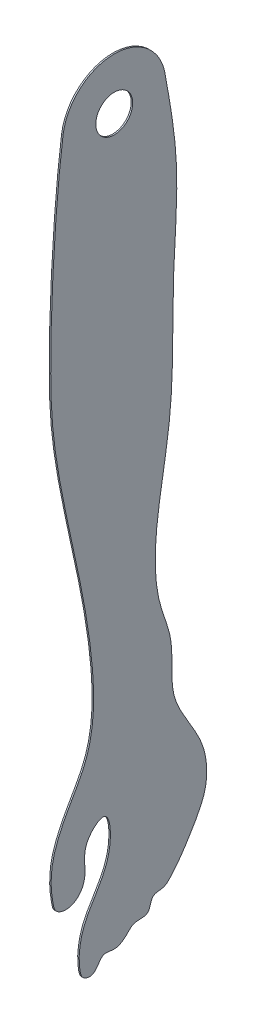
ISO-10303-21;
HEADER;
FILE_DESCRIPTION(('STEP AP214'),'2;1');
FILE_NAME('part.step','',(''),(''),'','','');
FILE_SCHEMA(('AUTOMOTIVE_DESIGN { 1 0 10303 214 1 1 1 1 }'));
ENDSEC;
DATA;
#1=APPLICATION_CONTEXT('core data for automotive mechanical design processes');
#2=APPLICATION_PROTOCOL_DEFINITION('international standard','automotive_design',2000,#1);
#3=PRODUCT_CONTEXT('',#1,'mechanical');
#4=PRODUCT('Part','Part','',(#3));
#5=PRODUCT_RELATED_PRODUCT_CATEGORY('part','',(#4));
#6=PRODUCT_DEFINITION_FORMATION('','',#4);
#7=PRODUCT_DEFINITION_CONTEXT('part definition',#1,'design');
#8=PRODUCT_DEFINITION('design','',#6,#7);
#9=PRODUCT_DEFINITION_SHAPE('','',#8);
#10=(LENGTH_UNIT() NAMED_UNIT(*) SI_UNIT(.MILLI.,.METRE.));
#11=(NAMED_UNIT(*) PLANE_ANGLE_UNIT() SI_UNIT($,.RADIAN.));
#12=(NAMED_UNIT(*) SI_UNIT($,.STERADIAN.) SOLID_ANGLE_UNIT());
#13=UNCERTAINTY_MEASURE_WITH_UNIT(LENGTH_MEASURE(1.E-05),#10,'distance_accuracy_value','');
#14=(GEOMETRIC_REPRESENTATION_CONTEXT(3) GLOBAL_UNCERTAINTY_ASSIGNED_CONTEXT((#13)) GLOBAL_UNIT_ASSIGNED_CONTEXT((#10,
#11,#12)) REPRESENTATION_CONTEXT('',''));
#15=CARTESIAN_POINT('',(0.,0.,0.));
#16=DIRECTION('',(0.,0.,1.));
#17=DIRECTION('',(1.,0.,0.));
#18=AXIS2_PLACEMENT_3D('',#15,#16,#17);
#19=CARTESIAN_POINT('',(0.5,-470.695495920654,-32.564069297625));
#20=DIRECTION('',(-1.,0.,0.));
#21=DIRECTION('',(0.,0.,1.));
#22=AXIS2_PLACEMENT_3D('',#19,#20,#21);
#23=PLANE('',#22);
#24=CARTESIAN_POINT('',(0.5,4.84342607559019,34.663254663264));
#25=CARTESIAN_POINT('',(0.5,-27.6945101411992,39.2097143148243));
#26=CARTESIAN_POINT('',(0.5,-94.602341537494,43.8253437916141));
#27=CARTESIAN_POINT('',(0.5,-198.598302487994,41.9481905668525));
#28=CARTESIAN_POINT('',(0.5,-277.322783368698,14.2559636365352));
#29=CARTESIAN_POINT('',(0.5,-368.678198151885,12.6392348257419));
#30=CARTESIAN_POINT('',(0.5,-395.489292518655,34.7778587810881));
#31=CARTESIAN_POINT('',(0.5,-424.363716062608,43.9961982217251));
#32=CARTESIAN_POINT('',(0.5,-438.492947409828,42.4433739515045));
#33=CARTESIAN_POINT('',(0.5,-449.39351604392,40.0542419448712));
#34=CARTESIAN_POINT('',(0.5,-452.844976712865,28.6471589689562));
#35=CARTESIAN_POINT('',(0.5,-438.487431053053,15.8626505210391));
#36=CARTESIAN_POINT('',(0.5,-420.969365898723,24.6171518315931));
#37=CARTESIAN_POINT('',(0.5,-402.825630116979,4.10890140988524));
#38=CARTESIAN_POINT('',(0.5,-441.301358898829,-0.432349691545669));
#39=CARTESIAN_POINT('',(0.5,-457.553565045305,22.1795761977817));
#40=CARTESIAN_POINT('',(0.5,-486.558139521146,24.6349685175613));
#41=CARTESIAN_POINT('',(0.5,-497.149262830604,21.7490331244814));
#42=CARTESIAN_POINT('',(0.5,-500.057224659205,12.2916528858937));
#43=CARTESIAN_POINT('',(0.5,-487.522190972307,9.37691063868993));
#44=CARTESIAN_POINT('',(0.5,-491.594407946684,-1.21192247305871));
#45=CARTESIAN_POINT('',(0.5,-486.857235759237,-7.89661129154015));
#46=CARTESIAN_POINT('',(0.5,-480.101469825372,-13.4267508486342));
#47=CARTESIAN_POINT('',(0.5,-483.037631145475,-24.4663014557142));
#48=CARTESIAN_POINT('',(0.5,-470.049165916606,-24.5979004021521));
#49=CARTESIAN_POINT('',(0.5,-471.666382451168,-33.1257170838295));
#50=CARTESIAN_POINT('',(0.5,-462.941926344635,-42.7563367641466));
#51=CARTESIAN_POINT('',(0.5,-439.795919170851,-57.4218579267833));
#52=CARTESIAN_POINT('',(0.5,-421.922104703587,-63.5966285254258));
#53=CARTESIAN_POINT('',(0.5,-393.728942846172,-62.0936437236474));
#54=CARTESIAN_POINT('',(0.5,-366.180340210842,-34.9063663756032));
#55=CARTESIAN_POINT('',(0.5,-330.246003030058,-41.4700836991726));
#56=CARTESIAN_POINT('',(0.5,-279.816511076801,-19.3597958544962));
#57=CARTESIAN_POINT('',(0.5,-206.310424789051,-42.2092897836021));
#58=CARTESIAN_POINT('',(0.5,-121.859738431938,-38.1853590858408));
#59=CARTESIAN_POINT('',(0.5,-53.3820430506886,-44.9238099029606));
#60=CARTESIAN_POINT('',(0.5,-13.9916706165611,-38.0783024191802));
#61=CARTESIAN_POINT('',(0.5,4.01677711395926,-34.7687431699331));
#62=B_SPLINE_CURVE_WITH_KNOTS('',3,(#24,#25,#26,#27,#28,#29,#30,#31,#32,#33,#34,#35,#36,#37,#38,
#39,#40,#41,#42,#43,#44,#45,#46,#47,#48,#49,#50,#51,#52,#53,#54,#55,#56,#57,#58,#59,#60,#61),
.UNSPECIFIED.,.F.,.F.,(4,1,1,1,1,1,1,1,1,1,1,1,1,1,1,1,1,1,1,1,1,1,1,1,1,1,1,1,1,1,1,1,1,1,1,4),
(0.,0.0812816878309083,0.100900369627512,0.19618681796604,0.230170317341964,0.256809284422416,
0.261911269248106,0.27904806600434,0.28214693998285,0.290757909438674,0.303690757779682,
0.325214072900232,0.338388057280681,0.352847421297276,0.39712228397798,0.418552512933069,
0.421852214822318,0.430119302870476,0.442912300460825,0.451129664267341,0.462260478364209,
0.468901072458414,0.480315632075845,0.490025771006037,0.499359222531804,0.503696536529243,
0.530098647152515,0.536467206925385,0.564081870430035,0.611865287841324,0.646902569601267,
0.670168967748456,0.781143971862764,0.870016231410823,0.93787950709035,0.9950979500628),.UNSPECIFIED.);
#63=CARTESIAN_POINT('',(0.5,4.84342607559018,34.663254663264));
#64=VERTEX_POINT('',#63);
#65=CARTESIAN_POINT('',(0.5,4.01677711395927,-34.7687431699332));
#66=VERTEX_POINT('',#65);
#67=EDGE_CURVE('E67',#64,#66,#62,.T.);
#68=ORIENTED_EDGE('',*,*,#67,.T.);
#69=CARTESIAN_POINT('',(0.5,0.,0.));
#70=DIRECTION('',(1.,0.,0.));
#71=DIRECTION('',(0.,0.,-1.));
#72=AXIS2_PLACEMENT_3D('',#69,#70,#71);
#73=CIRCLE('',#72,35.);
#74=EDGE_CURVE('E52',#66,#64,#73,.T.);
#75=ORIENTED_EDGE('',*,*,#74,.T.);
#76=EDGE_LOOP('',(#68,#75));
#77=FACE_BOUND('',#76,.T.);
#78=CARTESIAN_POINT('',(0.5,0.,0.));
#79=DIRECTION('',(1.,0.,0.));
#80=DIRECTION('',(0.,0.,-1.));
#81=AXIS2_PLACEMENT_3D('',#78,#79,#80);
#82=CIRCLE('',#81,12.5);
#83=CARTESIAN_POINT('',(0.5,0.,-12.5));
#84=VERTEX_POINT('',#83);
#85=EDGE_CURVE('E73',#84,#84,#82,.T.);
#86=ORIENTED_EDGE('',*,*,#85,.F.);
#87=EDGE_LOOP('',(#86));
#88=FACE_BOUND('',#87,.T.);
#89=ADVANCED_FACE('F35',(#77,#88),#23,.F.);
#90=CARTESIAN_POINT('',(-0.5,-470.695495920654,-32.564069297625));
#91=DIRECTION('',(-1.,0.,0.));
#92=DIRECTION('',(0.,0.,1.));
#93=AXIS2_PLACEMENT_3D('',#90,#91,#92);
#94=PLANE('',#93);
#95=CARTESIAN_POINT('',(-0.5,4.84342607559019,34.663254663264));
#96=CARTESIAN_POINT('',(-0.5,-27.6945101411992,39.2097143148243));
#97=CARTESIAN_POINT('',(-0.5,-94.602341537494,43.8253437916141));
#98=CARTESIAN_POINT('',(-0.5,-198.598302487994,41.9481905668525));
#99=CARTESIAN_POINT('',(-0.5,-277.322783368698,14.2559636365352));
#100=CARTESIAN_POINT('',(-0.5,-368.678198151885,12.6392348257419));
#101=CARTESIAN_POINT('',(-0.5,-395.489292518655,34.7778587810881));
#102=CARTESIAN_POINT('',(-0.5,-424.363716062608,43.9961982217251));
#103=CARTESIAN_POINT('',(-0.5,-438.492947409828,42.4433739515045));
#104=CARTESIAN_POINT('',(-0.5,-449.39351604392,40.0542419448712));
#105=CARTESIAN_POINT('',(-0.5,-452.844976712865,28.6471589689562));
#106=CARTESIAN_POINT('',(-0.5,-438.487431053053,15.8626505210391));
#107=CARTESIAN_POINT('',(-0.5,-420.969365898723,24.6171518315931));
#108=CARTESIAN_POINT('',(-0.5,-402.825630116979,4.10890140988524));
#109=CARTESIAN_POINT('',(-0.5,-441.301358898829,-0.432349691545669));
#110=CARTESIAN_POINT('',(-0.5,-457.553565045305,22.1795761977817));
#111=CARTESIAN_POINT('',(-0.5,-486.558139521146,24.6349685175613));
#112=CARTESIAN_POINT('',(-0.5,-497.149262830604,21.7490331244814));
#113=CARTESIAN_POINT('',(-0.5,-500.057224659205,12.2916528858937));
#114=CARTESIAN_POINT('',(-0.5,-487.522190972307,9.37691063868993));
#115=CARTESIAN_POINT('',(-0.5,-491.594407946684,-1.21192247305871));
#116=CARTESIAN_POINT('',(-0.5,-486.857235759237,-7.89661129154015));
#117=CARTESIAN_POINT('',(-0.5,-480.101469825372,-13.4267508486342));
#118=CARTESIAN_POINT('',(-0.5,-483.037631145475,-24.4663014557142));
#119=CARTESIAN_POINT('',(-0.5,-470.049165916606,-24.5979004021521));
#120=CARTESIAN_POINT('',(-0.5,-471.666382451168,-33.1257170838295));
#121=CARTESIAN_POINT('',(-0.5,-462.941926344635,-42.7563367641466));
#122=CARTESIAN_POINT('',(-0.5,-439.795919170851,-57.4218579267833));
#123=CARTESIAN_POINT('',(-0.5,-421.922104703587,-63.5966285254258));
#124=CARTESIAN_POINT('',(-0.5,-393.728942846172,-62.0936437236474));
#125=CARTESIAN_POINT('',(-0.5,-366.180340210842,-34.9063663756032));
#126=CARTESIAN_POINT('',(-0.5,-330.246003030058,-41.4700836991726));
#127=CARTESIAN_POINT('',(-0.5,-279.816511076801,-19.3597958544962));
#128=CARTESIAN_POINT('',(-0.5,-206.310424789051,-42.2092897836021));
#129=CARTESIAN_POINT('',(-0.5,-121.859738431938,-38.1853590858408));
#130=CARTESIAN_POINT('',(-0.5,-53.3820430506886,-44.9238099029606));
#131=CARTESIAN_POINT('',(-0.5,-13.9916706165611,-38.0783024191802));
#132=CARTESIAN_POINT('',(-0.5,4.01677711395926,-34.7687431699331));
#133=B_SPLINE_CURVE_WITH_KNOTS('',3,(#95,#96,#97,#98,#99,#100,#101,#102,#103,#104,#105,#106,
#107,#108,#109,#110,#111,#112,#113,#114,#115,#116,#117,#118,#119,#120,#121,#122,#123,#124,#125,
#126,#127,#128,#129,#130,#131,#132),.UNSPECIFIED.,.F.,.F.,(4,1,1,1,1,1,1,1,1,1,1,1,1,1,1,1,1,1,
1,1,1,1,1,1,1,1,1,1,1,1,1,1,1,1,1,4),(0.,0.0812816878309083,0.100900369627512,0.19618681796604,
0.230170317341964,0.256809284422416,0.261911269248106,0.27904806600434,0.28214693998285,
0.290757909438674,0.303690757779682,0.325214072900232,0.338388057280681,0.352847421297276,
0.39712228397798,0.418552512933069,0.421852214822318,0.430119302870476,0.442912300460825,
0.451129664267341,0.462260478364209,0.468901072458414,0.480315632075845,0.490025771006037,
0.499359222531804,0.503696536529243,0.530098647152515,0.536467206925385,0.564081870430035,
0.611865287841324,0.646902569601267,0.670168967748456,0.781143971862764,0.870016231410823,
0.93787950709035,0.9950979500628),.UNSPECIFIED.);
#134=CARTESIAN_POINT('',(-0.5,4.84342607559018,34.663254663264));
#135=VERTEX_POINT('',#134);
#136=CARTESIAN_POINT('',(-0.5,4.01677711395927,-34.7687431699332));
#137=VERTEX_POINT('',#136);
#138=EDGE_CURVE('E68',#135,#137,#133,.T.);
#139=ORIENTED_EDGE('',*,*,#138,.F.);
#140=CARTESIAN_POINT('',(-0.5,0.,0.));
#141=DIRECTION('',(1.,0.,0.));
#142=DIRECTION('',(0.,0.,-1.));
#143=AXIS2_PLACEMENT_3D('',#140,#141,#142);
#144=CIRCLE('',#143,35.);
#145=EDGE_CURVE('E60',#137,#135,#144,.T.);
#146=ORIENTED_EDGE('',*,*,#145,.F.);
#147=EDGE_LOOP('',(#139,#146));
#148=FACE_BOUND('',#147,.T.);
#149=CARTESIAN_POINT('',(-0.5,0.,0.));
#150=DIRECTION('',(1.,0.,0.));
#151=DIRECTION('',(0.,0.,-1.));
#152=AXIS2_PLACEMENT_3D('',#149,#150,#151);
#153=CIRCLE('',#152,12.5);
#154=CARTESIAN_POINT('',(-0.5,0.,-12.5));
#155=VERTEX_POINT('',#154);
#156=EDGE_CURVE('E76',#155,#155,#153,.T.);
#157=ORIENTED_EDGE('',*,*,#156,.T.);
#158=EDGE_LOOP('',(#157));
#159=FACE_BOUND('',#158,.T.);
#160=ADVANCED_FACE('F71',(#148,#159),#94,.T.);
#161=DIRECTION('',(-1.,0.,0.));
#162=VECTOR('',#161,1.);
#163=SURFACE_OF_LINEAR_EXTRUSION('',#62,#162);
#164=ORIENTED_EDGE('',*,*,#138,.T.);
#165=DIRECTION('',(-1.,0.,0.));
#166=VECTOR('',#165,1.);
#167=CARTESIAN_POINT('',(0.5,4.01677711395927,-34.7687431699332));
#168=LINE('',#167,#166);
#169=EDGE_CURVE('E11',#66,#137,#168,.T.);
#170=ORIENTED_EDGE('',*,*,#169,.F.);
#171=ORIENTED_EDGE('',*,*,#67,.F.);
#172=DIRECTION('',(-1.,0.,0.));
#173=VECTOR('',#172,1.);
#174=CARTESIAN_POINT('',(0.5,4.84342607559018,34.663254663264));
#175=LINE('',#174,#173);
#176=EDGE_CURVE('E45',#64,#135,#175,.T.);
#177=ORIENTED_EDGE('',*,*,#176,.T.);
#178=EDGE_LOOP('',(#164,#170,#171,#177));
#179=FACE_BOUND('',#178,.T.);
#180=ADVANCED_FACE('F37',(#179),#163,.F.);
#181=CARTESIAN_POINT('',(0.5,0.,0.));
#182=DIRECTION('',(-1.,0.,0.));
#183=DIRECTION('',(0.,0.,1.));
#184=AXIS2_PLACEMENT_3D('',#181,#182,#183);
#185=CYLINDRICAL_SURFACE('',#184,35.);
#186=ORIENTED_EDGE('',*,*,#145,.T.);
#187=ORIENTED_EDGE('',*,*,#176,.F.);
#188=ORIENTED_EDGE('',*,*,#74,.F.);
#189=ORIENTED_EDGE('',*,*,#169,.T.);
#190=EDGE_LOOP('',(#186,#187,#188,#189));
#191=FACE_BOUND('',#190,.T.);
#192=ADVANCED_FACE('F63',(#191),#185,.T.);
#193=CARTESIAN_POINT('',(0.5,0.,0.));
#194=DIRECTION('',(-1.,0.,0.));
#195=DIRECTION('',(0.,0.,1.));
#196=AXIS2_PLACEMENT_3D('',#193,#194,#195);
#197=CYLINDRICAL_SURFACE('',#196,12.5);
#198=ORIENTED_EDGE('',*,*,#85,.T.);
#199=EDGE_LOOP('',(#198));
#200=FACE_BOUND('',#199,.T.);
#201=ORIENTED_EDGE('',*,*,#156,.F.);
#202=EDGE_LOOP('',(#201));
#203=FACE_BOUND('',#202,.T.);
#204=ADVANCED_FACE('F94',(#200,#203),#197,.F.);
#205=CLOSED_SHELL('',(#89,#160,#180,#192,#204));
#206=MANIFOLD_SOLID_BREP('B2',#205);
#207=ADVANCED_BREP_SHAPE_REPRESENTATION('',(#18,#206),#14);
#208=SHAPE_DEFINITION_REPRESENTATION(#9,#207);
ENDSEC;
END-ISO-10303-21;
